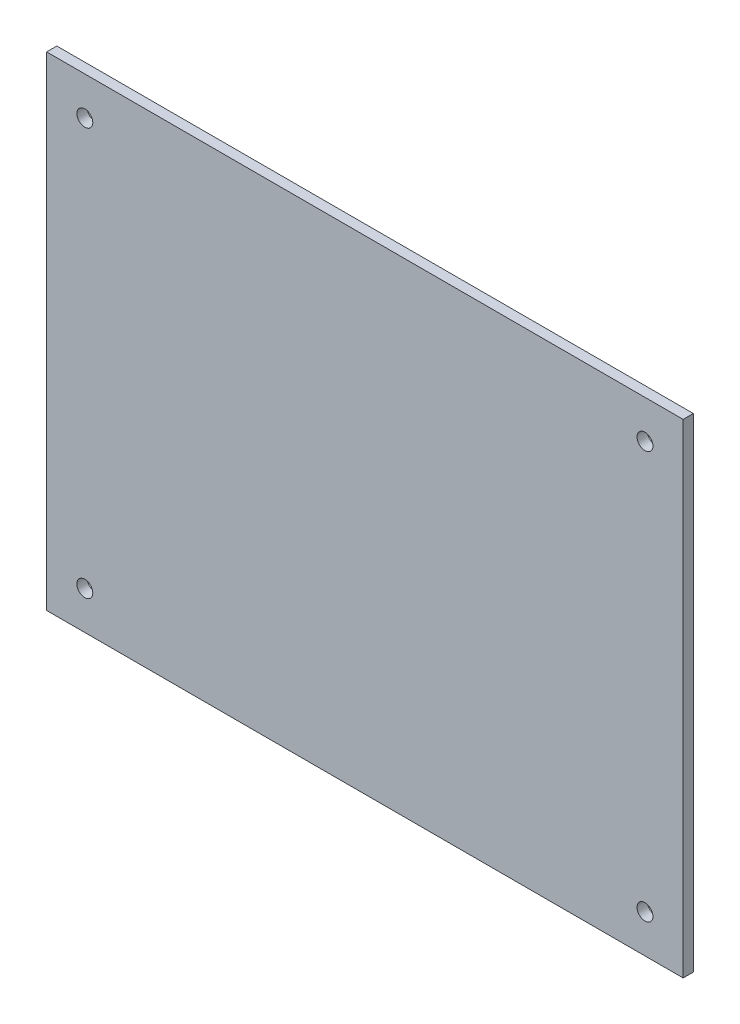
ISO-10303-21;
HEADER;
FILE_DESCRIPTION(('STEP AP214'),'2;1');
FILE_NAME('part.step','',(''),(''),'','','');
FILE_SCHEMA(('AUTOMOTIVE_DESIGN { 1 0 10303 214 1 1 1 1 }'));
ENDSEC;
DATA;
#1=APPLICATION_CONTEXT('core data for automotive mechanical design processes');
#2=APPLICATION_PROTOCOL_DEFINITION('international standard','automotive_design',2000,#1);
#3=PRODUCT_CONTEXT('',#1,'mechanical');
#4=PRODUCT('Part','Part','',(#3));
#5=PRODUCT_RELATED_PRODUCT_CATEGORY('part','',(#4));
#6=PRODUCT_DEFINITION_FORMATION('','',#4);
#7=PRODUCT_DEFINITION_CONTEXT('part definition',#1,'design');
#8=PRODUCT_DEFINITION('design','',#6,#7);
#9=PRODUCT_DEFINITION_SHAPE('','',#8);
#10=(LENGTH_UNIT() NAMED_UNIT(*) SI_UNIT(.MILLI.,.METRE.));
#11=(NAMED_UNIT(*) PLANE_ANGLE_UNIT() SI_UNIT($,.RADIAN.));
#12=(NAMED_UNIT(*) SI_UNIT($,.STERADIAN.) SOLID_ANGLE_UNIT());
#13=UNCERTAINTY_MEASURE_WITH_UNIT(LENGTH_MEASURE(1.E-05),#10,'distance_accuracy_value','');
#14=(GEOMETRIC_REPRESENTATION_CONTEXT(3) GLOBAL_UNCERTAINTY_ASSIGNED_CONTEXT((#13)) GLOBAL_UNIT_ASSIGNED_CONTEXT((#10,
#11,#12)) REPRESENTATION_CONTEXT('',''));
#15=CARTESIAN_POINT('',(0.,0.,0.));
#16=DIRECTION('',(0.,0.,1.));
#17=DIRECTION('',(1.,0.,0.));
#18=AXIS2_PLACEMENT_3D('',#15,#16,#17);
#19=CARTESIAN_POINT('',(0.,0.,1.6));
#20=DIRECTION('',(0.,0.,-1.));
#21=DIRECTION('',(-1.,0.,0.));
#22=AXIS2_PLACEMENT_3D('',#19,#20,#21);
#23=PLANE('',#22);
#24=DIRECTION('',(0.,1.,0.));
#25=VECTOR('',#24,1.);
#26=CARTESIAN_POINT('',(50.,-38.,1.6));
#27=LINE('',#26,#25);
#28=CARTESIAN_POINT('',(50.,-38.,1.6));
#29=VERTEX_POINT('',#28);
#30=CARTESIAN_POINT('',(50.,38.,1.6));
#31=VERTEX_POINT('',#30);
#32=EDGE_CURVE('E89',#29,#31,#27,.T.);
#33=ORIENTED_EDGE('',*,*,#32,.T.);
#34=DIRECTION('',(-1.,0.,0.));
#35=VECTOR('',#34,1.);
#36=CARTESIAN_POINT('',(-50.,38.,1.6));
#37=LINE('',#36,#35);
#38=CARTESIAN_POINT('',(-50.,38.,1.6));
#39=VERTEX_POINT('',#38);
#40=EDGE_CURVE('E84',#31,#39,#37,.T.);
#41=ORIENTED_EDGE('',*,*,#40,.T.);
#42=DIRECTION('',(0.,-1.,0.));
#43=VECTOR('',#42,1.);
#44=CARTESIAN_POINT('',(-50.,-38.,1.6));
#45=LINE('',#44,#43);
#46=CARTESIAN_POINT('',(-50.,-38.,1.6));
#47=VERTEX_POINT('',#46);
#48=EDGE_CURVE('E87',#39,#47,#45,.T.);
#49=ORIENTED_EDGE('',*,*,#48,.T.);
#50=DIRECTION('',(1.,0.,0.));
#51=VECTOR('',#50,1.);
#52=CARTESIAN_POINT('',(-50.,-38.,1.6));
#53=LINE('',#52,#51);
#54=EDGE_CURVE('E54',#47,#29,#53,.T.);
#55=ORIENTED_EDGE('',*,*,#54,.T.);
#56=EDGE_LOOP('',(#33,#41,#49,#55));
#57=FACE_BOUND('',#56,.T.);
#58=CARTESIAN_POINT('',(-44.,32.,1.6));
#59=DIRECTION('',(0.,0.,1.));
#60=DIRECTION('',(1.,0.,0.));
#61=AXIS2_PLACEMENT_3D('',#58,#59,#60);
#62=CIRCLE('',#61,1.25);
#63=CARTESIAN_POINT('',(-42.75,32.,1.6));
#64=VERTEX_POINT('',#63);
#65=EDGE_CURVE('E104',#64,#64,#62,.T.);
#66=ORIENTED_EDGE('',*,*,#65,.F.);
#67=EDGE_LOOP('',(#66));
#68=FACE_BOUND('',#67,.T.);
#69=CARTESIAN_POINT('',(44.,32.,1.6));
#70=DIRECTION('',(0.,0.,1.));
#71=DIRECTION('',(1.,0.,0.));
#72=AXIS2_PLACEMENT_3D('',#69,#70,#71);
#73=CIRCLE('',#72,1.25);
#74=CARTESIAN_POINT('',(45.25,32.,1.6));
#75=VERTEX_POINT('',#74);
#76=EDGE_CURVE('E119',#75,#75,#73,.T.);
#77=ORIENTED_EDGE('',*,*,#76,.F.);
#78=EDGE_LOOP('',(#77));
#79=FACE_BOUND('',#78,.T.);
#80=CARTESIAN_POINT('',(44.,-32.,1.6));
#81=DIRECTION('',(0.,0.,1.));
#82=DIRECTION('',(1.,0.,0.));
#83=AXIS2_PLACEMENT_3D('',#80,#81,#82);
#84=CIRCLE('',#83,1.25);
#85=CARTESIAN_POINT('',(45.25,-32.,1.6));
#86=VERTEX_POINT('',#85);
#87=EDGE_CURVE('E125',#86,#86,#84,.T.);
#88=ORIENTED_EDGE('',*,*,#87,.F.);
#89=EDGE_LOOP('',(#88));
#90=FACE_BOUND('',#89,.T.);
#91=CARTESIAN_POINT('',(-44.,-32.,1.6));
#92=DIRECTION('',(0.,0.,1.));
#93=DIRECTION('',(1.,0.,0.));
#94=AXIS2_PLACEMENT_3D('',#91,#92,#93);
#95=CIRCLE('',#94,1.25);
#96=CARTESIAN_POINT('',(-42.75,-32.,1.6));
#97=VERTEX_POINT('',#96);
#98=EDGE_CURVE('E131',#97,#97,#95,.T.);
#99=ORIENTED_EDGE('',*,*,#98,.F.);
#100=EDGE_LOOP('',(#99));
#101=FACE_BOUND('',#100,.T.);
#102=ADVANCED_FACE('F37',(#57,#68,#79,#90,#101),#23,.F.);
#103=CARTESIAN_POINT('',(0.,0.,0.));
#104=DIRECTION('',(0.,0.,-1.));
#105=DIRECTION('',(-1.,0.,0.));
#106=AXIS2_PLACEMENT_3D('',#103,#104,#105);
#107=PLANE('',#106);
#108=CARTESIAN_POINT('',(44.,-32.,0.));
#109=DIRECTION('',(0.,0.,1.));
#110=DIRECTION('',(1.,0.,0.));
#111=AXIS2_PLACEMENT_3D('',#108,#109,#110);
#112=CIRCLE('',#111,1.25);
#113=CARTESIAN_POINT('',(45.25,-32.,0.));
#114=VERTEX_POINT('',#113);
#115=EDGE_CURVE('E128',#114,#114,#112,.T.);
#116=ORIENTED_EDGE('',*,*,#115,.T.);
#117=EDGE_LOOP('',(#116));
#118=FACE_BOUND('',#117,.T.);
#119=CARTESIAN_POINT('',(-44.,32.,0.));
#120=DIRECTION('',(0.,0.,1.));
#121=DIRECTION('',(1.,0.,0.));
#122=AXIS2_PLACEMENT_3D('',#119,#120,#121);
#123=CIRCLE('',#122,1.25);
#124=CARTESIAN_POINT('',(-42.75,32.,0.));
#125=VERTEX_POINT('',#124);
#126=EDGE_CURVE('E116',#125,#125,#123,.T.);
#127=ORIENTED_EDGE('',*,*,#126,.T.);
#128=EDGE_LOOP('',(#127));
#129=FACE_BOUND('',#128,.T.);
#130=DIRECTION('',(0.,1.,0.));
#131=VECTOR('',#130,1.);
#132=CARTESIAN_POINT('',(50.,-38.,0.));
#133=LINE('',#132,#131);
#134=CARTESIAN_POINT('',(50.,-38.,0.));
#135=VERTEX_POINT('',#134);
#136=CARTESIAN_POINT('',(50.,38.,0.));
#137=VERTEX_POINT('',#136);
#138=EDGE_CURVE('E101',#135,#137,#133,.T.);
#139=ORIENTED_EDGE('',*,*,#138,.F.);
#140=DIRECTION('',(1.,0.,0.));
#141=VECTOR('',#140,1.);
#142=CARTESIAN_POINT('',(-50.,-38.,0.));
#143=LINE('',#142,#141);
#144=CARTESIAN_POINT('',(-50.,-38.,0.));
#145=VERTEX_POINT('',#144);
#146=EDGE_CURVE('E77',#145,#135,#143,.T.);
#147=ORIENTED_EDGE('',*,*,#146,.F.);
#148=DIRECTION('',(0.,-1.,0.));
#149=VECTOR('',#148,1.);
#150=CARTESIAN_POINT('',(-50.,-38.,0.));
#151=LINE('',#150,#149);
#152=CARTESIAN_POINT('',(-50.,38.,0.));
#153=VERTEX_POINT('',#152);
#154=EDGE_CURVE('E71',#153,#145,#151,.T.);
#155=ORIENTED_EDGE('',*,*,#154,.F.);
#156=DIRECTION('',(-1.,0.,0.));
#157=VECTOR('',#156,1.);
#158=CARTESIAN_POINT('',(-50.,38.,0.));
#159=LINE('',#158,#157);
#160=EDGE_CURVE('E93',#137,#153,#159,.T.);
#161=ORIENTED_EDGE('',*,*,#160,.F.);
#162=EDGE_LOOP('',(#139,#147,#155,#161));
#163=FACE_BOUND('',#162,.T.);
#164=CARTESIAN_POINT('',(44.,32.,0.));
#165=DIRECTION('',(0.,0.,1.));
#166=DIRECTION('',(1.,0.,0.));
#167=AXIS2_PLACEMENT_3D('',#164,#165,#166);
#168=CIRCLE('',#167,1.25);
#169=CARTESIAN_POINT('',(45.25,32.,0.));
#170=VERTEX_POINT('',#169);
#171=EDGE_CURVE('E122',#170,#170,#168,.T.);
#172=ORIENTED_EDGE('',*,*,#171,.T.);
#173=EDGE_LOOP('',(#172));
#174=FACE_BOUND('',#173,.T.);
#175=CARTESIAN_POINT('',(-44.,-32.,0.));
#176=DIRECTION('',(0.,0.,1.));
#177=DIRECTION('',(1.,0.,0.));
#178=AXIS2_PLACEMENT_3D('',#175,#176,#177);
#179=CIRCLE('',#178,1.25);
#180=CARTESIAN_POINT('',(-42.75,-32.,0.));
#181=VERTEX_POINT('',#180);
#182=EDGE_CURVE('E134',#181,#181,#179,.T.);
#183=ORIENTED_EDGE('',*,*,#182,.T.);
#184=EDGE_LOOP('',(#183));
#185=FACE_BOUND('',#184,.T.);
#186=ADVANCED_FACE('F112',(#118,#129,#163,#174,#185),#107,.T.);
#187=CARTESIAN_POINT('',(50.,-38.,1.6));
#188=DIRECTION('',(-1.,0.,0.));
#189=DIRECTION('',(0.,0.,1.));
#190=AXIS2_PLACEMENT_3D('',#187,#188,#189);
#191=PLANE('',#190);
#192=ORIENTED_EDGE('',*,*,#138,.T.);
#193=DIRECTION('',(0.,0.,-1.));
#194=VECTOR('',#193,1.);
#195=CARTESIAN_POINT('',(50.,38.,1.6));
#196=LINE('',#195,#194);
#197=EDGE_CURVE('E11',#31,#137,#196,.T.);
#198=ORIENTED_EDGE('',*,*,#197,.F.);
#199=ORIENTED_EDGE('',*,*,#32,.F.);
#200=DIRECTION('',(0.,0.,-1.));
#201=VECTOR('',#200,1.);
#202=CARTESIAN_POINT('',(50.,-38.,1.6));
#203=LINE('',#202,#201);
#204=EDGE_CURVE('E97',#29,#135,#203,.T.);
#205=ORIENTED_EDGE('',*,*,#204,.T.);
#206=EDGE_LOOP('',(#192,#198,#199,#205));
#207=FACE_BOUND('',#206,.T.);
#208=ADVANCED_FACE('F39',(#207),#191,.F.);
#209=CARTESIAN_POINT('',(-50.,38.,1.6));
#210=DIRECTION('',(0.,-1.,0.));
#211=DIRECTION('',(0.,0.,-1.));
#212=AXIS2_PLACEMENT_3D('',#209,#210,#211);
#213=PLANE('',#212);
#214=ORIENTED_EDGE('',*,*,#160,.T.);
#215=DIRECTION('',(0.,0.,-1.));
#216=VECTOR('',#215,1.);
#217=CARTESIAN_POINT('',(-50.,38.,1.6));
#218=LINE('',#217,#216);
#219=EDGE_CURVE('E46',#39,#153,#218,.T.);
#220=ORIENTED_EDGE('',*,*,#219,.F.);
#221=ORIENTED_EDGE('',*,*,#40,.F.);
#222=ORIENTED_EDGE('',*,*,#197,.T.);
#223=EDGE_LOOP('',(#214,#220,#221,#222));
#224=FACE_BOUND('',#223,.T.);
#225=ADVANCED_FACE('F92',(#224),#213,.F.);
#226=CARTESIAN_POINT('',(-50.,-38.,1.6));
#227=DIRECTION('',(1.,0.,0.));
#228=DIRECTION('',(0.,0.,-1.));
#229=AXIS2_PLACEMENT_3D('',#226,#227,#228);
#230=PLANE('',#229);
#231=ORIENTED_EDGE('',*,*,#154,.T.);
#232=DIRECTION('',(0.,0.,-1.));
#233=VECTOR('',#232,1.);
#234=CARTESIAN_POINT('',(-50.,-38.,1.6));
#235=LINE('',#234,#233);
#236=EDGE_CURVE('E94',#47,#145,#235,.T.);
#237=ORIENTED_EDGE('',*,*,#236,.F.);
#238=ORIENTED_EDGE('',*,*,#48,.F.);
#239=ORIENTED_EDGE('',*,*,#219,.T.);
#240=EDGE_LOOP('',(#231,#237,#238,#239));
#241=FACE_BOUND('',#240,.T.);
#242=ADVANCED_FACE('F95',(#241),#230,.F.);
#243=CARTESIAN_POINT('',(-50.,-38.,1.6));
#244=DIRECTION('',(0.,1.,0.));
#245=DIRECTION('',(0.,0.,1.));
#246=AXIS2_PLACEMENT_3D('',#243,#244,#245);
#247=PLANE('',#246);
#248=ORIENTED_EDGE('',*,*,#146,.T.);
#249=ORIENTED_EDGE('',*,*,#204,.F.);
#250=ORIENTED_EDGE('',*,*,#54,.F.);
#251=ORIENTED_EDGE('',*,*,#236,.T.);
#252=EDGE_LOOP('',(#248,#249,#250,#251));
#253=FACE_BOUND('',#252,.T.);
#254=ADVANCED_FACE('F109',(#253),#247,.F.);
#255=CARTESIAN_POINT('',(-44.,32.,1.6));
#256=DIRECTION('',(0.,0.,-1.));
#257=DIRECTION('',(-1.,0.,0.));
#258=AXIS2_PLACEMENT_3D('',#255,#256,#257);
#259=CYLINDRICAL_SURFACE('',#258,1.25);
#260=ORIENTED_EDGE('',*,*,#65,.T.);
#261=EDGE_LOOP('',(#260));
#262=FACE_BOUND('',#261,.T.);
#263=ORIENTED_EDGE('',*,*,#126,.F.);
#264=EDGE_LOOP('',(#263));
#265=FACE_BOUND('',#264,.T.);
#266=ADVANCED_FACE('F151',(#262,#265),#259,.F.);
#267=CARTESIAN_POINT('',(44.,32.,1.6));
#268=DIRECTION('',(0.,0.,-1.));
#269=DIRECTION('',(-1.,0.,0.));
#270=AXIS2_PLACEMENT_3D('',#267,#268,#269);
#271=CYLINDRICAL_SURFACE('',#270,1.25);
#272=ORIENTED_EDGE('',*,*,#76,.T.);
#273=EDGE_LOOP('',(#272));
#274=FACE_BOUND('',#273,.T.);
#275=ORIENTED_EDGE('',*,*,#171,.F.);
#276=EDGE_LOOP('',(#275));
#277=FACE_BOUND('',#276,.T.);
#278=ADVANCED_FACE('F205',(#274,#277),#271,.F.);
#279=CARTESIAN_POINT('',(44.,-32.,1.6));
#280=DIRECTION('',(0.,0.,-1.));
#281=DIRECTION('',(-1.,0.,0.));
#282=AXIS2_PLACEMENT_3D('',#279,#280,#281);
#283=CYLINDRICAL_SURFACE('',#282,1.25);
#284=ORIENTED_EDGE('',*,*,#87,.T.);
#285=EDGE_LOOP('',(#284));
#286=FACE_BOUND('',#285,.T.);
#287=ORIENTED_EDGE('',*,*,#115,.F.);
#288=EDGE_LOOP('',(#287));
#289=FACE_BOUND('',#288,.T.);
#290=ADVANCED_FACE('F214',(#286,#289),#283,.F.);
#291=CARTESIAN_POINT('',(-44.,-32.,1.6));
#292=DIRECTION('',(0.,0.,-1.));
#293=DIRECTION('',(-1.,0.,0.));
#294=AXIS2_PLACEMENT_3D('',#291,#292,#293);
#295=CYLINDRICAL_SURFACE('',#294,1.25);
#296=ORIENTED_EDGE('',*,*,#98,.T.);
#297=EDGE_LOOP('',(#296));
#298=FACE_BOUND('',#297,.T.);
#299=ORIENTED_EDGE('',*,*,#182,.F.);
#300=EDGE_LOOP('',(#299));
#301=FACE_BOUND('',#300,.T.);
#302=ADVANCED_FACE('F140',(#298,#301),#295,.F.);
#303=CLOSED_SHELL('',(#102,#186,#208,#225,#242,#254,#266,#278,#290,#302));
#304=MANIFOLD_SOLID_BREP('B2',#303);
#305=ADVANCED_BREP_SHAPE_REPRESENTATION('',(#18,#304),#14);
#306=SHAPE_DEFINITION_REPRESENTATION(#9,#305);
ENDSEC;
END-ISO-10303-21;
